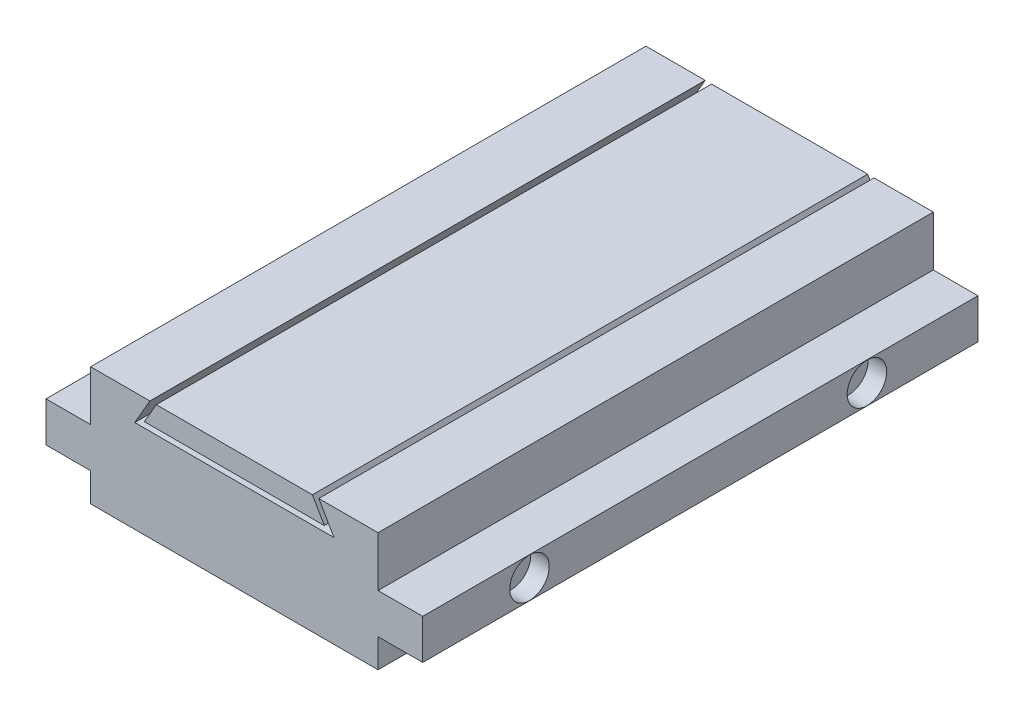
ISO-10303-21;
HEADER;
FILE_DESCRIPTION(('STEP AP214'),'2;1');
FILE_NAME('part.step','',(''),(''),'','','');
FILE_SCHEMA(('AUTOMOTIVE_DESIGN { 1 0 10303 214 1 1 1 1 }'));
ENDSEC;
DATA;
#1=APPLICATION_CONTEXT('core data for automotive mechanical design processes');
#2=APPLICATION_PROTOCOL_DEFINITION('international standard','automotive_design',2000,#1);
#3=PRODUCT_CONTEXT('',#1,'mechanical');
#4=PRODUCT('Part','Part','',(#3));
#5=PRODUCT_RELATED_PRODUCT_CATEGORY('part','',(#4));
#6=PRODUCT_DEFINITION_FORMATION('','',#4);
#7=PRODUCT_DEFINITION_CONTEXT('part definition',#1,'design');
#8=PRODUCT_DEFINITION('design','',#6,#7);
#9=PRODUCT_DEFINITION_SHAPE('','',#8);
#10=(LENGTH_UNIT() NAMED_UNIT(*) SI_UNIT(.MILLI.,.METRE.));
#11=(NAMED_UNIT(*) PLANE_ANGLE_UNIT() SI_UNIT($,.RADIAN.));
#12=(NAMED_UNIT(*) SI_UNIT($,.STERADIAN.) SOLID_ANGLE_UNIT());
#13=UNCERTAINTY_MEASURE_WITH_UNIT(LENGTH_MEASURE(1.E-05),#10,'distance_accuracy_value','');
#14=(GEOMETRIC_REPRESENTATION_CONTEXT(3) GLOBAL_UNCERTAINTY_ASSIGNED_CONTEXT((#13)) GLOBAL_UNIT_ASSIGNED_CONTEXT((#10,
#11,#12)) REPRESENTATION_CONTEXT('',''));
#15=CARTESIAN_POINT('',(0.,0.,0.));
#16=DIRECTION('',(0.,0.,1.));
#17=DIRECTION('',(1.,0.,0.));
#18=AXIS2_PLACEMENT_3D('',#15,#16,#17);
#19=CARTESIAN_POINT('',(0.,0.,0.));
#20=DIRECTION('',(0.,0.,-1.));
#21=DIRECTION('',(-1.,0.,0.));
#22=AXIS2_PLACEMENT_3D('',#19,#20,#21);
#23=PLANE('',#22);
#24=DIRECTION('',(1.,0.,0.));
#25=VECTOR('',#24,1.);
#26=CARTESIAN_POINT('',(-3.88140502764066,-3.208799954,0.));
#27=LINE('',#26,#25);
#28=CARTESIAN_POINT('',(-3.88140502764066,-3.208799954,0.));
#29=VERTEX_POINT('',#28);
#30=CARTESIAN_POINT('',(3.88140502764066,-3.208799954,0.));
#31=VERTEX_POINT('',#30);
#32=EDGE_CURVE('E179',#29,#31,#27,.T.);
#33=ORIENTED_EDGE('',*,*,#32,.F.);
#34=DIRECTION('',(0.,1.,0.));
#35=VECTOR('',#34,1.);
#36=CARTESIAN_POINT('',(-3.88140502764066,0.,0.));
#37=LINE('',#36,#35);
#38=CARTESIAN_POINT('',(-3.88140502764066,-2.4331984368042,0.));
#39=VERTEX_POINT('',#38);
#40=EDGE_CURVE('E317',#29,#39,#37,.T.);
#41=ORIENTED_EDGE('',*,*,#40,.T.);
#42=DIRECTION('',(-1.,0.,0.));
#43=VECTOR('',#42,1.);
#44=CARTESIAN_POINT('',(0.,-2.4331984368042,0.));
#45=LINE('',#44,#43);
#46=CARTESIAN_POINT('',(-5.08790502764066,-2.43319843680419,0.));
#47=VERTEX_POINT('',#46);
#48=EDGE_CURVE('E202',#39,#47,#45,.T.);
#49=ORIENTED_EDGE('',*,*,#48,.T.);
#50=DIRECTION('',(0.,1.,0.));
#51=VECTOR('',#50,1.);
#52=CARTESIAN_POINT('',(-5.08790502764066,0.,0.));
#53=LINE('',#52,#51);
#54=CARTESIAN_POINT('',(-5.08790502764066,-1.35369843680419,0.));
#55=VERTEX_POINT('',#54);
#56=EDGE_CURVE('E196',#47,#55,#53,.T.);
#57=ORIENTED_EDGE('',*,*,#56,.T.);
#58=DIRECTION('',(1.,0.,0.));
#59=VECTOR('',#58,1.);
#60=CARTESIAN_POINT('',(0.,-1.3536984368042,0.));
#61=LINE('',#60,#59);
#62=CARTESIAN_POINT('',(-3.88140502764066,-1.3536984368042,0.));
#63=VERTEX_POINT('',#62);
#64=EDGE_CURVE('E186',#55,#63,#61,.T.);
#65=ORIENTED_EDGE('',*,*,#64,.T.);
#66=DIRECTION('',(0.,-1.,0.));
#67=VECTOR('',#66,1.);
#68=CARTESIAN_POINT('',(-3.88140502764066,0.,0.));
#69=LINE('',#68,#67);
#70=CARTESIAN_POINT('',(-3.88140502764066,0.,0.));
#71=VERTEX_POINT('',#70);
#72=EDGE_CURVE('E98',#71,#63,#69,.T.);
#73=ORIENTED_EDGE('',*,*,#72,.F.);
#74=DIRECTION('',(-1.,0.,0.));
#75=VECTOR('',#74,1.);
#76=CARTESIAN_POINT('',(-2.28140502764066,0.,0.));
#77=LINE('',#76,#75);
#78=CARTESIAN_POINT('',(-2.28140502764066,0.,0.));
#79=VERTEX_POINT('',#78);
#80=EDGE_CURVE('E234',#79,#71,#77,.T.);
#81=ORIENTED_EDGE('',*,*,#80,.F.);
#82=DIRECTION('',(0.5,0.866025403784439,0.));
#83=VECTOR('',#82,1.);
#84=CARTESIAN_POINT('',(-2.28140502764066,0.,0.));
#85=LINE('',#84,#83);
#86=CARTESIAN_POINT('',(-2.69063087188416,-0.708799953999999,0.));
#87=VERTEX_POINT('',#86);
#88=EDGE_CURVE('E237',#87,#79,#85,.T.);
#89=ORIENTED_EDGE('',*,*,#88,.F.);
#90=DIRECTION('',(-1.,0.,0.));
#91=VECTOR('',#90,1.);
#92=CARTESIAN_POINT('',(-2.69063087188416,-0.708799953999999,0.));
#93=LINE('',#92,#91);
#94=CARTESIAN_POINT('',(2.69063087188416,-0.708799953999999,0.));
#95=VERTEX_POINT('',#94);
#96=EDGE_CURVE('E241',#95,#87,#93,.T.);
#97=ORIENTED_EDGE('',*,*,#96,.F.);
#98=DIRECTION('',(0.5,-0.866025403784439,0.));
#99=VECTOR('',#98,1.);
#100=CARTESIAN_POINT('',(2.69063087188416,-0.708799953999999,0.));
#101=LINE('',#100,#99);
#102=CARTESIAN_POINT('',(2.28140502764066,0.,0.));
#103=VERTEX_POINT('',#102);
#104=EDGE_CURVE('E244',#103,#95,#101,.T.);
#105=ORIENTED_EDGE('',*,*,#104,.F.);
#106=DIRECTION('',(-1.,0.,0.));
#107=VECTOR('',#106,1.);
#108=CARTESIAN_POINT('',(3.88140502764066,0.,0.));
#109=LINE('',#108,#107);
#110=CARTESIAN_POINT('',(3.88140502764066,0.,0.));
#111=VERTEX_POINT('',#110);
#112=EDGE_CURVE('E247',#111,#103,#109,.T.);
#113=ORIENTED_EDGE('',*,*,#112,.F.);
#114=DIRECTION('',(0.,1.,0.));
#115=VECTOR('',#114,1.);
#116=CARTESIAN_POINT('',(3.88140502764066,-3.208799954,0.));
#117=LINE('',#116,#115);
#118=CARTESIAN_POINT('',(3.88140502764066,-1.3536984368042,0.));
#119=VERTEX_POINT('',#118);
#120=EDGE_CURVE('E92',#119,#111,#117,.T.);
#121=ORIENTED_EDGE('',*,*,#120,.F.);
#122=DIRECTION('',(1.,0.,0.));
#123=VECTOR('',#122,1.);
#124=CARTESIAN_POINT('',(0.,-1.3536984368042,0.));
#125=LINE('',#124,#123);
#126=CARTESIAN_POINT('',(5.08790502764066,-1.3536984368042,0.));
#127=VERTEX_POINT('',#126);
#128=EDGE_CURVE('E323',#119,#127,#125,.T.);
#129=ORIENTED_EDGE('',*,*,#128,.T.);
#130=DIRECTION('',(0.,-1.,0.));
#131=VECTOR('',#130,1.);
#132=CARTESIAN_POINT('',(5.08790502764066,0.,0.));
#133=LINE('',#132,#131);
#134=CARTESIAN_POINT('',(5.08790502764066,-2.4331984368042,0.));
#135=VERTEX_POINT('',#134);
#136=EDGE_CURVE('E326',#127,#135,#133,.T.);
#137=ORIENTED_EDGE('',*,*,#136,.T.);
#138=DIRECTION('',(-1.,0.,0.));
#139=VECTOR('',#138,1.);
#140=CARTESIAN_POINT('',(0.,-2.4331984368042,0.));
#141=LINE('',#140,#139);
#142=CARTESIAN_POINT('',(3.88140502764066,-2.4331984368042,0.));
#143=VERTEX_POINT('',#142);
#144=EDGE_CURVE('E320',#135,#143,#141,.T.);
#145=ORIENTED_EDGE('',*,*,#144,.T.);
#146=DIRECTION('',(0.,-1.,0.));
#147=VECTOR('',#146,1.);
#148=CARTESIAN_POINT('',(3.88140502764066,0.,0.));
#149=LINE('',#148,#147);
#150=EDGE_CURVE('E296',#143,#31,#149,.T.);
#151=ORIENTED_EDGE('',*,*,#150,.T.);
#152=EDGE_LOOP('',(#33,#41,#49,#57,#65,#73,#81,#89,#97,#105,#113,#121,#129,#137,#145,#151));
#153=FACE_BOUND('',#152,.T.);
#154=ADVANCED_FACE('F49',(#153),#23,.T.);
#155=CARTESIAN_POINT('',(0.,0.,15.));
#156=DIRECTION('',(0.,0.,1.));
#157=DIRECTION('',(1.,0.,0.));
#158=AXIS2_PLACEMENT_3D('',#155,#156,#157);
#159=PLANE('',#158);
#160=DIRECTION('',(1.,0.,0.));
#161=VECTOR('',#160,1.);
#162=CARTESIAN_POINT('',(0.,-2.4331984368042,15.));
#163=LINE('',#162,#161);
#164=CARTESIAN_POINT('',(-5.08790502764066,-2.43319843680419,15.));
#165=VERTEX_POINT('',#164);
#166=CARTESIAN_POINT('',(-3.88140502764066,-2.4331984368042,15.));
#167=VERTEX_POINT('',#166);
#168=EDGE_CURVE('E12',#165,#167,#163,.T.);
#169=ORIENTED_EDGE('',*,*,#168,.T.);
#170=DIRECTION('',(0.,-1.,0.));
#171=VECTOR('',#170,1.);
#172=CARTESIAN_POINT('',(-3.88140502764066,0.,15.));
#173=LINE('',#172,#171);
#174=CARTESIAN_POINT('',(-3.88140502764066,-3.208799954,15.));
#175=VERTEX_POINT('',#174);
#176=EDGE_CURVE('E315',#167,#175,#173,.T.);
#177=ORIENTED_EDGE('',*,*,#176,.T.);
#178=DIRECTION('',(1.,0.,0.));
#179=VECTOR('',#178,1.);
#180=CARTESIAN_POINT('',(-3.88140502764066,-3.208799954,15.));
#181=LINE('',#180,#179);
#182=CARTESIAN_POINT('',(3.88140502764066,-3.208799954,15.));
#183=VERTEX_POINT('',#182);
#184=EDGE_CURVE('E225',#175,#183,#181,.T.);
#185=ORIENTED_EDGE('',*,*,#184,.T.);
#186=DIRECTION('',(0.,1.,0.));
#187=VECTOR('',#186,1.);
#188=CARTESIAN_POINT('',(3.88140502764066,0.,15.));
#189=LINE('',#188,#187);
#190=CARTESIAN_POINT('',(3.88140502764066,-2.4331984368042,15.));
#191=VERTEX_POINT('',#190);
#192=EDGE_CURVE('E293',#183,#191,#189,.T.);
#193=ORIENTED_EDGE('',*,*,#192,.T.);
#194=DIRECTION('',(1.,0.,0.));
#195=VECTOR('',#194,1.);
#196=CARTESIAN_POINT('',(0.,-2.4331984368042,15.));
#197=LINE('',#196,#195);
#198=CARTESIAN_POINT('',(5.08790502764066,-2.4331984368042,15.));
#199=VERTEX_POINT('',#198);
#200=EDGE_CURVE('E276',#191,#199,#197,.T.);
#201=ORIENTED_EDGE('',*,*,#200,.T.);
#202=DIRECTION('',(0.,1.,0.));
#203=VECTOR('',#202,1.);
#204=CARTESIAN_POINT('',(5.08790502764066,0.,15.));
#205=LINE('',#204,#203);
#206=CARTESIAN_POINT('',(5.08790502764066,-1.3536984368042,15.));
#207=VERTEX_POINT('',#206);
#208=EDGE_CURVE('E279',#199,#207,#205,.T.);
#209=ORIENTED_EDGE('',*,*,#208,.T.);
#210=DIRECTION('',(-1.,0.,0.));
#211=VECTOR('',#210,1.);
#212=CARTESIAN_POINT('',(0.,-1.3536984368042,15.));
#213=LINE('',#212,#211);
#214=CARTESIAN_POINT('',(3.88140502764066,-1.3536984368042,15.));
#215=VERTEX_POINT('',#214);
#216=EDGE_CURVE('E282',#207,#215,#213,.T.);
#217=ORIENTED_EDGE('',*,*,#216,.T.);
#218=DIRECTION('',(0.,1.,0.));
#219=VECTOR('',#218,1.);
#220=CARTESIAN_POINT('',(3.88140502764066,-3.208799954,15.));
#221=LINE('',#220,#219);
#222=CARTESIAN_POINT('',(3.88140502764066,0.,15.));
#223=VERTEX_POINT('',#222);
#224=EDGE_CURVE('E105',#215,#223,#221,.T.);
#225=ORIENTED_EDGE('',*,*,#224,.T.);
#226=DIRECTION('',(-1.,0.,0.));
#227=VECTOR('',#226,1.);
#228=CARTESIAN_POINT('',(3.88140502764066,0.,15.));
#229=LINE('',#228,#227);
#230=CARTESIAN_POINT('',(2.28140502764066,0.,15.));
#231=VERTEX_POINT('',#230);
#232=EDGE_CURVE('E222',#223,#231,#229,.T.);
#233=ORIENTED_EDGE('',*,*,#232,.T.);
#234=DIRECTION('',(0.5,-0.866025403784439,0.));
#235=VECTOR('',#234,1.);
#236=CARTESIAN_POINT('',(2.69063087188416,-0.708799953999999,15.));
#237=LINE('',#236,#235);
#238=CARTESIAN_POINT('',(2.69063087188416,-0.708799953999999,15.));
#239=VERTEX_POINT('',#238);
#240=EDGE_CURVE('E219',#231,#239,#237,.T.);
#241=ORIENTED_EDGE('',*,*,#240,.T.);
#242=DIRECTION('',(-1.,0.,0.));
#243=VECTOR('',#242,1.);
#244=CARTESIAN_POINT('',(-2.69063087188416,-0.708799953999999,15.));
#245=LINE('',#244,#243);
#246=CARTESIAN_POINT('',(-2.69063087188416,-0.708799953999999,15.));
#247=VERTEX_POINT('',#246);
#248=EDGE_CURVE('E217',#239,#247,#245,.T.);
#249=ORIENTED_EDGE('',*,*,#248,.T.);
#250=DIRECTION('',(0.5,0.866025403784439,0.));
#251=VECTOR('',#250,1.);
#252=CARTESIAN_POINT('',(-2.28140502764066,0.,15.));
#253=LINE('',#252,#251);
#254=CARTESIAN_POINT('',(-2.28140502764066,0.,15.));
#255=VERTEX_POINT('',#254);
#256=EDGE_CURVE('E180',#247,#255,#253,.T.);
#257=ORIENTED_EDGE('',*,*,#256,.T.);
#258=DIRECTION('',(-1.,0.,0.));
#259=VECTOR('',#258,1.);
#260=CARTESIAN_POINT('',(-2.28140502764066,0.,15.));
#261=LINE('',#260,#259);
#262=CARTESIAN_POINT('',(-3.88140502764066,0.,15.));
#263=VERTEX_POINT('',#262);
#264=EDGE_CURVE('E230',#255,#263,#261,.T.);
#265=ORIENTED_EDGE('',*,*,#264,.T.);
#266=DIRECTION('',(0.,-1.,0.));
#267=VECTOR('',#266,1.);
#268=CARTESIAN_POINT('',(-3.88140502764066,0.,15.));
#269=LINE('',#268,#267);
#270=CARTESIAN_POINT('',(-3.88140502764066,-1.3536984368042,15.));
#271=VERTEX_POINT('',#270);
#272=EDGE_CURVE('E228',#263,#271,#269,.T.);
#273=ORIENTED_EDGE('',*,*,#272,.T.);
#274=DIRECTION('',(-1.,0.,0.));
#275=VECTOR('',#274,1.);
#276=CARTESIAN_POINT('',(0.,-1.3536984368042,15.));
#277=LINE('',#276,#275);
#278=CARTESIAN_POINT('',(-5.08790502764066,-1.35369843680419,15.));
#279=VERTEX_POINT('',#278);
#280=EDGE_CURVE('E189',#271,#279,#277,.T.);
#281=ORIENTED_EDGE('',*,*,#280,.T.);
#282=DIRECTION('',(0.,-1.,0.));
#283=VECTOR('',#282,1.);
#284=CARTESIAN_POINT('',(-5.08790502764066,0.,15.));
#285=LINE('',#284,#283);
#286=EDGE_CURVE('E57',#279,#165,#285,.T.);
#287=ORIENTED_EDGE('',*,*,#286,.T.);
#288=EDGE_LOOP('',(#169,#177,#185,#193,#201,#209,#217,#225,#233,#241,#249,#257,#265,#273,#281,#287));
#289=FACE_BOUND('',#288,.T.);
#290=ADVANCED_FACE('F285',(#289),#159,.T.);
#291=CARTESIAN_POINT('',(-3.88140502764066,-3.208799954,-8.39985815946717));
#292=DIRECTION('',(0.,-1.,0.));
#293=DIRECTION('',(0.,0.,-1.));
#294=AXIS2_PLACEMENT_3D('',#291,#292,#293);
#295=PLANE('',#294);
#296=CARTESIAN_POINT('',(0.,-3.208799954,13.73));
#297=DIRECTION('',(0.,-1.,0.));
#298=DIRECTION('',(0.,0.,-1.));
#299=AXIS2_PLACEMENT_3D('',#296,#297,#298);
#300=CIRCLE('',#299,0.533400000000001);
#301=CARTESIAN_POINT('',(0.,-3.208799954,13.1966));
#302=VERTEX_POINT('',#301);
#303=EDGE_CURVE('E206',#302,#302,#300,.T.);
#304=ORIENTED_EDGE('',*,*,#303,.F.);
#305=EDGE_LOOP('',(#304));
#306=FACE_BOUND('',#305,.T.);
#307=CARTESIAN_POINT('',(0.,-3.208799954,9.92));
#308=DIRECTION('',(0.,-1.,0.));
#309=DIRECTION('',(0.,0.,-1.));
#310=AXIS2_PLACEMENT_3D('',#307,#308,#309);
#311=CIRCLE('',#310,0.533400000000001);
#312=CARTESIAN_POINT('',(0.,-3.208799954,9.3866));
#313=VERTEX_POINT('',#312);
#314=EDGE_CURVE('E210',#313,#313,#311,.T.);
#315=ORIENTED_EDGE('',*,*,#314,.F.);
#316=EDGE_LOOP('',(#315));
#317=FACE_BOUND('',#316,.T.);
#318=CARTESIAN_POINT('',(0.,-3.208799954,6.11));
#319=DIRECTION('',(0.,-1.,0.));
#320=DIRECTION('',(0.,0.,-1.));
#321=AXIS2_PLACEMENT_3D('',#318,#319,#320);
#322=CIRCLE('',#321,0.533400000000001);
#323=CARTESIAN_POINT('',(0.,-3.208799954,5.5766));
#324=VERTEX_POINT('',#323);
#325=EDGE_CURVE('E200',#324,#324,#322,.T.);
#326=ORIENTED_EDGE('',*,*,#325,.F.);
#327=EDGE_LOOP('',(#326));
#328=FACE_BOUND('',#327,.T.);
#329=CARTESIAN_POINT('',(1.19722895108931E-13,-3.208799954,2.3));
#330=DIRECTION('',(0.,-1.,0.));
#331=DIRECTION('',(0.,0.,-1.));
#332=AXIS2_PLACEMENT_3D('',#329,#330,#331);
#333=CIRCLE('',#332,0.533400000000001);
#334=CARTESIAN_POINT('',(1.19722895108931E-13,-3.208799954,1.7666));
#335=VERTEX_POINT('',#334);
#336=EDGE_CURVE('E197',#335,#335,#333,.T.);
#337=ORIENTED_EDGE('',*,*,#336,.F.);
#338=EDGE_LOOP('',(#337));
#339=FACE_BOUND('',#338,.T.);
#340=ORIENTED_EDGE('',*,*,#184,.F.);
#341=DIRECTION('',(0.,0.,-1.));
#342=VECTOR('',#341,1.);
#343=CARTESIAN_POINT('',(-3.88140502764066,-3.208799954,-8.39985815946717));
#344=LINE('',#343,#342);
#345=EDGE_CURVE('E273',#175,#29,#344,.T.);
#346=ORIENTED_EDGE('',*,*,#345,.T.);
#347=ORIENTED_EDGE('',*,*,#32,.T.);
#348=DIRECTION('',(0.,0.,1.));
#349=VECTOR('',#348,1.);
#350=CARTESIAN_POINT('',(3.88140502764066,-3.208799954,-8.39985815946717));
#351=LINE('',#350,#349);
#352=EDGE_CURVE('E260',#31,#183,#351,.T.);
#353=ORIENTED_EDGE('',*,*,#352,.T.);
#354=EDGE_LOOP('',(#340,#346,#347,#353));
#355=FACE_BOUND('',#354,.T.);
#356=ADVANCED_FACE('F386',(#306,#317,#328,#339,#355),#295,.T.);
#357=CARTESIAN_POINT('',(-3.88140502764066,0.,-8.39985815946717));
#358=DIRECTION('',(-1.,0.,0.));
#359=DIRECTION('',(0.,0.,1.));
#360=AXIS2_PLACEMENT_3D('',#357,#358,#359);
#361=PLANE('',#360);
#362=DIRECTION('',(0.,0.,1.));
#363=VECTOR('',#362,1.);
#364=CARTESIAN_POINT('',(-3.88140502764066,-1.3536984368042,-10.));
#365=LINE('',#364,#363);
#366=EDGE_CURVE('E178',#63,#271,#365,.T.);
#367=ORIENTED_EDGE('',*,*,#366,.T.);
#368=ORIENTED_EDGE('',*,*,#272,.F.);
#369=DIRECTION('',(0.,0.,1.));
#370=VECTOR('',#369,1.);
#371=CARTESIAN_POINT('',(-3.88140502764066,0.,-8.39985815946717));
#372=LINE('',#371,#370);
#373=EDGE_CURVE('E65',#71,#263,#372,.T.);
#374=ORIENTED_EDGE('',*,*,#373,.F.);
#375=ORIENTED_EDGE('',*,*,#72,.T.);
#376=EDGE_LOOP('',(#367,#368,#374,#375));
#377=FACE_BOUND('',#376,.T.);
#378=ADVANCED_FACE('F177',(#377),#361,.T.);
#379=CARTESIAN_POINT('',(3.88140502764066,-3.208799954,-8.39985815946717));
#380=DIRECTION('',(1.,0.,0.));
#381=DIRECTION('',(0.,0.,-1.));
#382=AXIS2_PLACEMENT_3D('',#379,#380,#381);
#383=PLANE('',#382);
#384=ORIENTED_EDGE('',*,*,#120,.T.);
#385=DIRECTION('',(0.,0.,1.));
#386=VECTOR('',#385,1.);
#387=CARTESIAN_POINT('',(3.88140502764066,0.,-8.39985815946717));
#388=LINE('',#387,#386);
#389=EDGE_CURVE('E249',#111,#223,#388,.T.);
#390=ORIENTED_EDGE('',*,*,#389,.T.);
#391=ORIENTED_EDGE('',*,*,#224,.F.);
#392=DIRECTION('',(0.,0.,1.));
#393=VECTOR('',#392,1.);
#394=CARTESIAN_POINT('',(3.88140502764066,-1.3536984368042,-10.));
#395=LINE('',#394,#393);
#396=EDGE_CURVE('E308',#119,#215,#395,.T.);
#397=ORIENTED_EDGE('',*,*,#396,.F.);
#398=EDGE_LOOP('',(#384,#390,#391,#397));
#399=FACE_BOUND('',#398,.T.);
#400=ADVANCED_FACE('F394',(#399),#383,.T.);
#401=CARTESIAN_POINT('',(3.88140502764066,0.,-8.39985815946717));
#402=DIRECTION('',(0.,1.,0.));
#403=DIRECTION('',(0.,0.,1.));
#404=AXIS2_PLACEMENT_3D('',#401,#402,#403);
#405=PLANE('',#404);
#406=ORIENTED_EDGE('',*,*,#389,.F.);
#407=ORIENTED_EDGE('',*,*,#112,.T.);
#408=DIRECTION('',(0.,0.,1.));
#409=VECTOR('',#408,1.);
#410=CARTESIAN_POINT('',(2.28140502764066,0.,-8.39985815946717));
#411=LINE('',#410,#409);
#412=EDGE_CURVE('E112',#103,#231,#411,.T.);
#413=ORIENTED_EDGE('',*,*,#412,.T.);
#414=ORIENTED_EDGE('',*,*,#232,.F.);
#415=EDGE_LOOP('',(#406,#407,#413,#414));
#416=FACE_BOUND('',#415,.T.);
#417=ADVANCED_FACE('F432',(#416),#405,.T.);
#418=CARTESIAN_POINT('',(2.69063087188416,-0.708799953999999,-8.39985815946717));
#419=DIRECTION('',(-0.866025403784439,-0.5,0.));
#420=DIRECTION('',(0.5,-0.866025403784439,0.));
#421=AXIS2_PLACEMENT_3D('',#418,#419,#420);
#422=PLANE('',#421);
#423=ORIENTED_EDGE('',*,*,#412,.F.);
#424=ORIENTED_EDGE('',*,*,#104,.T.);
#425=DIRECTION('',(0.,0.,1.));
#426=VECTOR('',#425,1.);
#427=CARTESIAN_POINT('',(2.69063087188416,-0.708799953999999,-8.39985815946717));
#428=LINE('',#427,#426);
#429=EDGE_CURVE('E243',#95,#239,#428,.T.);
#430=ORIENTED_EDGE('',*,*,#429,.T.);
#431=ORIENTED_EDGE('',*,*,#240,.F.);
#432=EDGE_LOOP('',(#423,#424,#430,#431));
#433=FACE_BOUND('',#432,.T.);
#434=ADVANCED_FACE('F600',(#433),#422,.T.);
#435=CARTESIAN_POINT('',(-2.69063087188416,-0.708799953999999,-8.39985815946717));
#436=DIRECTION('',(0.,1.,0.));
#437=DIRECTION('',(-1.,0.,0.));
#438=AXIS2_PLACEMENT_3D('',#435,#436,#437);
#439=PLANE('',#438);
#440=ORIENTED_EDGE('',*,*,#96,.T.);
#441=DIRECTION('',(0.,0.,1.));
#442=VECTOR('',#441,1.);
#443=CARTESIAN_POINT('',(-2.69063087188416,-0.708799953999999,-8.39985815946717));
#444=LINE('',#443,#442);
#445=EDGE_CURVE('E240',#87,#247,#444,.T.);
#446=ORIENTED_EDGE('',*,*,#445,.T.);
#447=ORIENTED_EDGE('',*,*,#248,.F.);
#448=ORIENTED_EDGE('',*,*,#429,.F.);
#449=EDGE_LOOP('',(#440,#446,#447,#448));
#450=FACE_BOUND('',#449,.T.);
#451=CARTESIAN_POINT('',(0.,-0.708799953999999,13.73));
#452=DIRECTION('',(0.,1.,0.));
#453=DIRECTION('',(-1.,0.,0.));
#454=AXIS2_PLACEMENT_3D('',#451,#452,#453);
#455=CIRCLE('',#454,0.533400000000001);
#456=CARTESIAN_POINT('',(-0.533400000000001,-0.708799953999999,13.73));
#457=VERTEX_POINT('',#456);
#458=EDGE_CURVE('E232',#457,#457,#455,.T.);
#459=ORIENTED_EDGE('',*,*,#458,.F.);
#460=EDGE_LOOP('',(#459));
#461=FACE_BOUND('',#460,.T.);
#462=CARTESIAN_POINT('',(0.,-0.708799953999999,9.92));
#463=DIRECTION('',(0.,1.,0.));
#464=DIRECTION('',(-1.,0.,0.));
#465=AXIS2_PLACEMENT_3D('',#462,#463,#464);
#466=CIRCLE('',#465,0.533400000000001);
#467=CARTESIAN_POINT('',(-0.533399999999961,-0.708799953999999,9.92));
#468=VERTEX_POINT('',#467);
#469=EDGE_CURVE('E266',#468,#468,#466,.T.);
#470=ORIENTED_EDGE('',*,*,#469,.F.);
#471=EDGE_LOOP('',(#470));
#472=FACE_BOUND('',#471,.T.);
#473=CARTESIAN_POINT('',(0.,-0.708799953999999,6.11));
#474=DIRECTION('',(0.,1.,0.));
#475=DIRECTION('',(-1.,0.,0.));
#476=AXIS2_PLACEMENT_3D('',#473,#474,#475);
#477=CIRCLE('',#476,0.533400000000001);
#478=CARTESIAN_POINT('',(-0.533399999999921,-0.708799953999999,6.11));
#479=VERTEX_POINT('',#478);
#480=EDGE_CURVE('E263',#479,#479,#477,.T.);
#481=ORIENTED_EDGE('',*,*,#480,.F.);
#482=EDGE_LOOP('',(#481));
#483=FACE_BOUND('',#482,.T.);
#484=CARTESIAN_POINT('',(1.19722895108931E-13,-0.708799953999999,2.3));
#485=DIRECTION('',(0.,1.,0.));
#486=DIRECTION('',(-1.,0.,0.));
#487=AXIS2_PLACEMENT_3D('',#484,#485,#486);
#488=CIRCLE('',#487,0.533400000000001);
#489=CARTESIAN_POINT('',(-0.533399999999881,-0.708799953999999,2.3));
#490=VERTEX_POINT('',#489);
#491=EDGE_CURVE('E209',#490,#490,#488,.T.);
#492=ORIENTED_EDGE('',*,*,#491,.F.);
#493=EDGE_LOOP('',(#492));
#494=FACE_BOUND('',#493,.T.);
#495=ADVANCED_FACE('F596',(#450,#461,#472,#483,#494),#439,.T.);
#496=CARTESIAN_POINT('',(-2.28140502764066,0.,-8.39985815946717));
#497=DIRECTION('',(0.866025403784439,-0.5,0.));
#498=DIRECTION('',(0.5,0.866025403784439,0.));
#499=AXIS2_PLACEMENT_3D('',#496,#497,#498);
#500=PLANE('',#499);
#501=ORIENTED_EDGE('',*,*,#445,.F.);
#502=ORIENTED_EDGE('',*,*,#88,.T.);
#503=DIRECTION('',(0.,0.,1.));
#504=VECTOR('',#503,1.);
#505=CARTESIAN_POINT('',(-2.28140502764066,0.,-8.39985815946717));
#506=LINE('',#505,#504);
#507=EDGE_CURVE('E236',#79,#255,#506,.T.);
#508=ORIENTED_EDGE('',*,*,#507,.T.);
#509=ORIENTED_EDGE('',*,*,#256,.F.);
#510=EDGE_LOOP('',(#501,#502,#508,#509));
#511=FACE_BOUND('',#510,.T.);
#512=ADVANCED_FACE('F593',(#511),#500,.T.);
#513=CARTESIAN_POINT('',(-2.28140502764066,0.,-8.39985815946717));
#514=DIRECTION('',(0.,1.,0.));
#515=DIRECTION('',(0.,0.,1.));
#516=AXIS2_PLACEMENT_3D('',#513,#514,#515);
#517=PLANE('',#516);
#518=ORIENTED_EDGE('',*,*,#507,.F.);
#519=ORIENTED_EDGE('',*,*,#80,.T.);
#520=ORIENTED_EDGE('',*,*,#373,.T.);
#521=ORIENTED_EDGE('',*,*,#264,.F.);
#522=EDGE_LOOP('',(#518,#519,#520,#521));
#523=FACE_BOUND('',#522,.T.);
#524=ADVANCED_FACE('F588',(#523),#517,.T.);
#525=CARTESIAN_POINT('',(1.19722895108931E-13,0.,2.3));
#526=DIRECTION('',(0.,-1.,0.));
#527=DIRECTION('',(0.,0.,-1.));
#528=AXIS2_PLACEMENT_3D('',#525,#526,#527);
#529=CYLINDRICAL_SURFACE('',#528,0.533400000000001);
#530=ORIENTED_EDGE('',*,*,#491,.T.);
#531=EDGE_LOOP('',(#530));
#532=FACE_BOUND('',#531,.T.);
#533=ORIENTED_EDGE('',*,*,#336,.T.);
#534=EDGE_LOOP('',(#533));
#535=FACE_BOUND('',#534,.T.);
#536=ADVANCED_FACE('F585',(#532,#535),#529,.F.);
#537=CARTESIAN_POINT('',(0.,0.,6.11));
#538=DIRECTION('',(0.,-1.,0.));
#539=DIRECTION('',(0.,0.,-1.));
#540=AXIS2_PLACEMENT_3D('',#537,#538,#539);
#541=CYLINDRICAL_SURFACE('',#540,0.533400000000001);
#542=ORIENTED_EDGE('',*,*,#480,.T.);
#543=EDGE_LOOP('',(#542));
#544=FACE_BOUND('',#543,.T.);
#545=ORIENTED_EDGE('',*,*,#325,.T.);
#546=EDGE_LOOP('',(#545));
#547=FACE_BOUND('',#546,.T.);
#548=ADVANCED_FACE('F581',(#544,#547),#541,.F.);
#549=CARTESIAN_POINT('',(0.,0.,9.92));
#550=DIRECTION('',(0.,-1.,0.));
#551=DIRECTION('',(0.,0.,-1.));
#552=AXIS2_PLACEMENT_3D('',#549,#550,#551);
#553=CYLINDRICAL_SURFACE('',#552,0.533400000000001);
#554=ORIENTED_EDGE('',*,*,#469,.T.);
#555=EDGE_LOOP('',(#554));
#556=FACE_BOUND('',#555,.T.);
#557=ORIENTED_EDGE('',*,*,#314,.T.);
#558=EDGE_LOOP('',(#557));
#559=FACE_BOUND('',#558,.T.);
#560=ADVANCED_FACE('F577',(#556,#559),#553,.F.);
#561=CARTESIAN_POINT('',(0.,0.,13.73));
#562=DIRECTION('',(0.,-1.,0.));
#563=DIRECTION('',(0.,0.,-1.));
#564=AXIS2_PLACEMENT_3D('',#561,#562,#563);
#565=CYLINDRICAL_SURFACE('',#564,0.533400000000001);
#566=ORIENTED_EDGE('',*,*,#458,.T.);
#567=EDGE_LOOP('',(#566));
#568=FACE_BOUND('',#567,.T.);
#569=ORIENTED_EDGE('',*,*,#303,.T.);
#570=EDGE_LOOP('',(#569));
#571=FACE_BOUND('',#570,.T.);
#572=ADVANCED_FACE('F441',(#568,#571),#565,.F.);
#573=CARTESIAN_POINT('',(-5.08790502764066,-1.35369843680419,-10.));
#574=DIRECTION('',(0.,1.,0.));
#575=DIRECTION('',(-1.,0.,0.));
#576=AXIS2_PLACEMENT_3D('',#573,#574,#575);
#577=PLANE('',#576);
#578=DIRECTION('',(0.,0.,1.));
#579=VECTOR('',#578,1.);
#580=CARTESIAN_POINT('',(-5.08790502764066,-1.35369843680419,-10.));
#581=LINE('',#580,#579);
#582=EDGE_CURVE('E290',#55,#279,#581,.T.);
#583=ORIENTED_EDGE('',*,*,#582,.T.);
#584=ORIENTED_EDGE('',*,*,#280,.F.);
#585=ORIENTED_EDGE('',*,*,#366,.F.);
#586=ORIENTED_EDGE('',*,*,#64,.F.);
#587=EDGE_LOOP('',(#583,#584,#585,#586));
#588=FACE_BOUND('',#587,.T.);
#589=ADVANCED_FACE('F185',(#588),#577,.T.);
#590=CARTESIAN_POINT('',(-5.08790502764066,-2.43319843680419,-10.));
#591=DIRECTION('',(-1.,0.,0.));
#592=DIRECTION('',(0.,0.,1.));
#593=AXIS2_PLACEMENT_3D('',#590,#591,#592);
#594=PLANE('',#593);
#595=CARTESIAN_POINT('',(-5.08790502764066,-1.89344843680419,3.));
#596=DIRECTION('',(-1.,0.,0.));
#597=DIRECTION('',(0.,-1.,0.));
#598=AXIS2_PLACEMENT_3D('',#595,#596,#597);
#599=CIRCLE('',#598,0.5334);
#600=CARTESIAN_POINT('',(-5.08790502764066,-2.42684843680419,3.));
#601=VERTEX_POINT('',#600);
#602=EDGE_CURVE('E342',#601,#601,#599,.T.);
#603=ORIENTED_EDGE('',*,*,#602,.F.);
#604=EDGE_LOOP('',(#603));
#605=FACE_BOUND('',#604,.T.);
#606=CARTESIAN_POINT('',(-5.08790502764066,-1.89344843680419,12.));
#607=DIRECTION('',(-1.,0.,0.));
#608=DIRECTION('',(0.,-1.,0.));
#609=AXIS2_PLACEMENT_3D('',#606,#607,#608);
#610=CIRCLE('',#609,0.533400004449535);
#611=CARTESIAN_POINT('',(-5.08790502764066,-2.42684844125373,12.));
#612=VERTEX_POINT('',#611);
#613=EDGE_CURVE('E335',#612,#612,#610,.T.);
#614=ORIENTED_EDGE('',*,*,#613,.F.);
#615=EDGE_LOOP('',(#614));
#616=FACE_BOUND('',#615,.T.);
#617=DIRECTION('',(0.,0.,1.));
#618=VECTOR('',#617,1.);
#619=CARTESIAN_POINT('',(-5.08790502764066,-2.43319843680419,-10.));
#620=LINE('',#619,#618);
#621=EDGE_CURVE('E292',#47,#165,#620,.T.);
#622=ORIENTED_EDGE('',*,*,#621,.T.);
#623=ORIENTED_EDGE('',*,*,#286,.F.);
#624=ORIENTED_EDGE('',*,*,#582,.F.);
#625=ORIENTED_EDGE('',*,*,#56,.F.);
#626=EDGE_LOOP('',(#622,#623,#624,#625));
#627=FACE_BOUND('',#626,.T.);
#628=ADVANCED_FACE('F289',(#605,#616,#627),#594,.T.);
#629=CARTESIAN_POINT('',(-3.88140502764066,-2.4331984368042,-10.));
#630=DIRECTION('',(0.,-1.,0.));
#631=DIRECTION('',(1.,0.,0.));
#632=AXIS2_PLACEMENT_3D('',#629,#630,#631);
#633=PLANE('',#632);
#634=DIRECTION('',(0.,0.,1.));
#635=VECTOR('',#634,1.);
#636=CARTESIAN_POINT('',(-3.88140502764066,-2.4331984368042,-10.));
#637=LINE('',#636,#635);
#638=EDGE_CURVE('E190',#39,#167,#637,.T.);
#639=ORIENTED_EDGE('',*,*,#638,.T.);
#640=ORIENTED_EDGE('',*,*,#168,.F.);
#641=ORIENTED_EDGE('',*,*,#621,.F.);
#642=ORIENTED_EDGE('',*,*,#48,.F.);
#643=EDGE_LOOP('',(#639,#640,#641,#642));
#644=FACE_BOUND('',#643,.T.);
#645=ADVANCED_FACE('F331',(#644),#633,.T.);
#646=CARTESIAN_POINT('',(-3.88140502764066,-3.708799954,-10.));
#647=DIRECTION('',(-1.,0.,0.));
#648=DIRECTION('',(0.,0.,1.));
#649=AXIS2_PLACEMENT_3D('',#646,#647,#648);
#650=PLANE('',#649);
#651=ORIENTED_EDGE('',*,*,#345,.F.);
#652=ORIENTED_EDGE('',*,*,#176,.F.);
#653=ORIENTED_EDGE('',*,*,#638,.F.);
#654=ORIENTED_EDGE('',*,*,#40,.F.);
#655=EDGE_LOOP('',(#651,#652,#653,#654));
#656=FACE_BOUND('',#655,.T.);
#657=ADVANCED_FACE('F333',(#656),#650,.T.);
#658=CARTESIAN_POINT('',(5.08790502764066,-2.4331984368042,-10.));
#659=DIRECTION('',(1.,0.,0.));
#660=DIRECTION('',(0.,0.,-1.));
#661=AXIS2_PLACEMENT_3D('',#658,#659,#660);
#662=PLANE('',#661);
#663=CARTESIAN_POINT('',(5.08790502764066,-1.8934484368042,12.1154800925036));
#664=DIRECTION('',(1.,0.,0.));
#665=DIRECTION('',(0.,0.,-1.));
#666=AXIS2_PLACEMENT_3D('',#663,#664,#665);
#667=CIRCLE('',#666,0.53340000432162);
#668=CARTESIAN_POINT('',(5.08790502764066,-1.8934484368042,11.582080088182));
#669=VERTEX_POINT('',#668);
#670=EDGE_CURVE('E353',#669,#669,#667,.T.);
#671=ORIENTED_EDGE('',*,*,#670,.F.);
#672=EDGE_LOOP('',(#671));
#673=FACE_BOUND('',#672,.T.);
#674=CARTESIAN_POINT('',(5.08790502764066,-1.8934484368042,3.));
#675=DIRECTION('',(1.,0.,0.));
#676=DIRECTION('',(0.,0.,-1.));
#677=AXIS2_PLACEMENT_3D('',#674,#675,#676);
#678=CIRCLE('',#677,0.533400004321622);
#679=CARTESIAN_POINT('',(5.08790502764066,-1.8934484368042,2.46659999567838));
#680=VERTEX_POINT('',#679);
#681=EDGE_CURVE('E347',#680,#680,#678,.T.);
#682=ORIENTED_EDGE('',*,*,#681,.F.);
#683=EDGE_LOOP('',(#682));
#684=FACE_BOUND('',#683,.T.);
#685=DIRECTION('',(0.,0.,1.));
#686=VECTOR('',#685,1.);
#687=CARTESIAN_POINT('',(5.08790502764066,-1.3536984368042,-10.));
#688=LINE('',#687,#686);
#689=EDGE_CURVE('E191',#127,#207,#688,.T.);
#690=ORIENTED_EDGE('',*,*,#689,.T.);
#691=ORIENTED_EDGE('',*,*,#208,.F.);
#692=DIRECTION('',(0.,0.,1.));
#693=VECTOR('',#692,1.);
#694=CARTESIAN_POINT('',(5.08790502764066,-2.4331984368042,-10.));
#695=LINE('',#694,#693);
#696=EDGE_CURVE('E301',#135,#199,#695,.T.);
#697=ORIENTED_EDGE('',*,*,#696,.F.);
#698=ORIENTED_EDGE('',*,*,#136,.F.);
#699=EDGE_LOOP('',(#690,#691,#697,#698));
#700=FACE_BOUND('',#699,.T.);
#701=ADVANCED_FACE('F368',(#673,#684,#700),#662,.T.);
#702=CARTESIAN_POINT('',(5.08790502764066,-1.3536984368042,-10.));
#703=DIRECTION('',(0.,1.,0.));
#704=DIRECTION('',(0.,0.,1.));
#705=AXIS2_PLACEMENT_3D('',#702,#703,#704);
#706=PLANE('',#705);
#707=ORIENTED_EDGE('',*,*,#396,.T.);
#708=ORIENTED_EDGE('',*,*,#216,.F.);
#709=ORIENTED_EDGE('',*,*,#689,.F.);
#710=ORIENTED_EDGE('',*,*,#128,.F.);
#711=EDGE_LOOP('',(#707,#708,#709,#710));
#712=FACE_BOUND('',#711,.T.);
#713=ADVANCED_FACE('F371',(#712),#706,.T.);
#714=CARTESIAN_POINT('',(3.88140502764066,-4.24157055804252,-10.));
#715=DIRECTION('',(1.,0.,0.));
#716=DIRECTION('',(0.,0.,-1.));
#717=AXIS2_PLACEMENT_3D('',#714,#715,#716);
#718=PLANE('',#717);
#719=DIRECTION('',(0.,0.,1.));
#720=VECTOR('',#719,1.);
#721=CARTESIAN_POINT('',(3.88140502764066,-2.4331984368042,-10.));
#722=LINE('',#721,#720);
#723=EDGE_CURVE('E304',#143,#191,#722,.T.);
#724=ORIENTED_EDGE('',*,*,#723,.T.);
#725=ORIENTED_EDGE('',*,*,#192,.F.);
#726=ORIENTED_EDGE('',*,*,#352,.F.);
#727=ORIENTED_EDGE('',*,*,#150,.F.);
#728=EDGE_LOOP('',(#724,#725,#726,#727));
#729=FACE_BOUND('',#728,.T.);
#730=ADVANCED_FACE('F383',(#729),#718,.T.);
#731=CARTESIAN_POINT('',(3.88140502764066,-2.4331984368042,-10.));
#732=DIRECTION('',(0.,-1.,0.));
#733=DIRECTION('',(0.,0.,-1.));
#734=AXIS2_PLACEMENT_3D('',#731,#732,#733);
#735=PLANE('',#734);
#736=ORIENTED_EDGE('',*,*,#696,.T.);
#737=ORIENTED_EDGE('',*,*,#200,.F.);
#738=ORIENTED_EDGE('',*,*,#723,.F.);
#739=ORIENTED_EDGE('',*,*,#144,.F.);
#740=EDGE_LOOP('',(#736,#737,#738,#739));
#741=FACE_BOUND('',#740,.T.);
#742=ADVANCED_FACE('F381',(#741),#735,.T.);
#743=CARTESIAN_POINT('',(-4.58790502764066,-1.89344843680419,12.));
#744=DIRECTION('',(-1.,0.,0.));
#745=DIRECTION('',(0.,-1.,0.));
#746=AXIS2_PLACEMENT_3D('',#743,#744,#745);
#747=CYLINDRICAL_SURFACE('',#746,0.533400004449535);
#748=CARTESIAN_POINT('',(-4.58790502764066,-1.89344843680419,12.));
#749=DIRECTION('',(-1.,0.,0.));
#750=DIRECTION('',(0.,-1.,0.));
#751=AXIS2_PLACEMENT_3D('',#748,#749,#750);
#752=CIRCLE('',#751,0.533400004449535);
#753=CARTESIAN_POINT('',(-4.58790502764066,-2.42684844125373,12.));
#754=VERTEX_POINT('',#753);
#755=EDGE_CURVE('E338',#754,#754,#752,.T.);
#756=ORIENTED_EDGE('',*,*,#755,.F.);
#757=EDGE_LOOP('',(#756));
#758=FACE_BOUND('',#757,.T.);
#759=ORIENTED_EDGE('',*,*,#613,.T.);
#760=EDGE_LOOP('',(#759));
#761=FACE_BOUND('',#760,.T.);
#762=ADVANCED_FACE('F487',(#758,#761),#747,.F.);
#763=CARTESIAN_POINT('',(-4.58790502764066,-1.89344843680419,12.));
#764=DIRECTION('',(-1.,0.,0.));
#765=DIRECTION('',(0.,-1.,0.));
#766=AXIS2_PLACEMENT_3D('',#763,#764,#765);
#767=PLANE('',#766);
#768=ORIENTED_EDGE('',*,*,#755,.T.);
#769=EDGE_LOOP('',(#768));
#770=FACE_BOUND('',#769,.T.);
#771=ADVANCED_FACE('F503',(#770),#767,.T.);
#772=CARTESIAN_POINT('',(-4.58790502764066,-1.89344843680419,3.));
#773=DIRECTION('',(-1.,0.,0.));
#774=DIRECTION('',(0.,-1.,0.));
#775=AXIS2_PLACEMENT_3D('',#772,#773,#774);
#776=CYLINDRICAL_SURFACE('',#775,0.5334);
#777=CARTESIAN_POINT('',(-4.58790502764066,-1.89344843680419,3.));
#778=DIRECTION('',(-1.,0.,0.));
#779=DIRECTION('',(0.,-1.,0.));
#780=AXIS2_PLACEMENT_3D('',#777,#778,#779);
#781=CIRCLE('',#780,0.5334);
#782=CARTESIAN_POINT('',(-4.58790502764066,-2.42684843680419,3.));
#783=VERTEX_POINT('',#782);
#784=EDGE_CURVE('E305',#783,#783,#781,.T.);
#785=ORIENTED_EDGE('',*,*,#784,.F.);
#786=EDGE_LOOP('',(#785));
#787=FACE_BOUND('',#786,.T.);
#788=ORIENTED_EDGE('',*,*,#602,.T.);
#789=EDGE_LOOP('',(#788));
#790=FACE_BOUND('',#789,.T.);
#791=ADVANCED_FACE('F513',(#787,#790),#776,.F.);
#792=CARTESIAN_POINT('',(-4.58790502764066,-1.89344843680419,3.));
#793=DIRECTION('',(-1.,0.,0.));
#794=DIRECTION('',(0.,-1.,0.));
#795=AXIS2_PLACEMENT_3D('',#792,#793,#794);
#796=PLANE('',#795);
#797=ORIENTED_EDGE('',*,*,#784,.T.);
#798=EDGE_LOOP('',(#797));
#799=FACE_BOUND('',#798,.T.);
#800=ADVANCED_FACE('F523',(#799),#796,.T.);
#801=CARTESIAN_POINT('',(4.58790502764066,-1.8934484368042,3.));
#802=DIRECTION('',(1.,0.,0.));
#803=DIRECTION('',(0.,0.,-1.));
#804=AXIS2_PLACEMENT_3D('',#801,#802,#803);
#805=CYLINDRICAL_SURFACE('',#804,0.533400004321622);
#806=CARTESIAN_POINT('',(4.58790502764066,-1.8934484368042,3.));
#807=DIRECTION('',(1.,0.,0.));
#808=DIRECTION('',(0.,0.,-1.));
#809=AXIS2_PLACEMENT_3D('',#806,#807,#808);
#810=CIRCLE('',#809,0.533400004321622);
#811=CARTESIAN_POINT('',(4.58790502764066,-1.8934484368042,2.46659999567838));
#812=VERTEX_POINT('',#811);
#813=EDGE_CURVE('E350',#812,#812,#810,.T.);
#814=ORIENTED_EDGE('',*,*,#813,.F.);
#815=EDGE_LOOP('',(#814));
#816=FACE_BOUND('',#815,.T.);
#817=ORIENTED_EDGE('',*,*,#681,.T.);
#818=EDGE_LOOP('',(#817));
#819=FACE_BOUND('',#818,.T.);
#820=ADVANCED_FACE('F533',(#816,#819),#805,.F.);
#821=CARTESIAN_POINT('',(4.58790502764066,-1.8934484368042,3.));
#822=DIRECTION('',(1.,0.,0.));
#823=DIRECTION('',(0.,0.,-1.));
#824=AXIS2_PLACEMENT_3D('',#821,#822,#823);
#825=PLANE('',#824);
#826=ORIENTED_EDGE('',*,*,#813,.T.);
#827=EDGE_LOOP('',(#826));
#828=FACE_BOUND('',#827,.T.);
#829=ADVANCED_FACE('F364',(#828),#825,.T.);
#830=CARTESIAN_POINT('',(4.58790502764066,-1.8934484368042,12.1154800925036));
#831=DIRECTION('',(1.,0.,0.));
#832=DIRECTION('',(0.,0.,-1.));
#833=AXIS2_PLACEMENT_3D('',#830,#831,#832);
#834=CYLINDRICAL_SURFACE('',#833,0.53340000432162);
#835=CARTESIAN_POINT('',(4.58790502764066,-1.8934484368042,12.1154800925036));
#836=DIRECTION('',(1.,0.,0.));
#837=DIRECTION('',(0.,0.,-1.));
#838=AXIS2_PLACEMENT_3D('',#835,#836,#837);
#839=CIRCLE('',#838,0.53340000432162);
#840=CARTESIAN_POINT('',(4.58790502764066,-1.8934484368042,11.582080088182));
#841=VERTEX_POINT('',#840);
#842=EDGE_CURVE('E339',#841,#841,#839,.T.);
#843=ORIENTED_EDGE('',*,*,#842,.F.);
#844=EDGE_LOOP('',(#843));
#845=FACE_BOUND('',#844,.T.);
#846=ORIENTED_EDGE('',*,*,#670,.T.);
#847=EDGE_LOOP('',(#846));
#848=FACE_BOUND('',#847,.T.);
#849=ADVANCED_FACE('F361',(#845,#848),#834,.F.);
#850=CARTESIAN_POINT('',(4.58790502764066,-1.8934484368042,12.1154800925036));
#851=DIRECTION('',(1.,0.,0.));
#852=DIRECTION('',(0.,0.,-1.));
#853=AXIS2_PLACEMENT_3D('',#850,#851,#852);
#854=PLANE('',#853);
#855=ORIENTED_EDGE('',*,*,#842,.T.);
#856=EDGE_LOOP('',(#855));
#857=FACE_BOUND('',#856,.T.);
#858=ADVANCED_FACE('F359',(#857),#854,.T.);
#859=CLOSED_SHELL('',(#154,#290,#356,#378,#400,#417,#434,#495,#512,#524,#536,#548,#560,#572,
#589,#628,#645,#657,#701,#713,#730,#742,#762,#771,#791,#800,#820,#829,#849,#858));
#860=MANIFOLD_SOLID_BREP('B2',#859);
#861=CARTESIAN_POINT('',(-2.43082333042316,-0.558799999999999,15.));
#862=DIRECTION('',(0.866025403784442,-0.499999999999994,0.));
#863=DIRECTION('',(0.499999999999994,0.866025403784442,0.));
#864=AXIS2_PLACEMENT_3D('',#861,#862,#863);
#865=PLANE('',#864);
#866=DIRECTION('',(-0.499999999999994,-0.866025403784442,0.));
#867=VECTOR('',#866,1.);
#868=CARTESIAN_POINT('',(-2.43082333042316,-0.558799999999999,0.));
#869=LINE('',#868,#867);
#870=CARTESIAN_POINT('',(-2.1082,0.,0.));
#871=VERTEX_POINT('',#870);
#872=CARTESIAN_POINT('',(-2.43082333042316,-0.558799999999999,0.));
#873=VERTEX_POINT('',#872);
#874=EDGE_CURVE('E782',#871,#873,#869,.T.);
#875=ORIENTED_EDGE('',*,*,#874,.T.);
#876=DIRECTION('',(0.,0.,-1.));
#877=VECTOR('',#876,1.);
#878=CARTESIAN_POINT('',(-2.43082333042316,-0.558799999999999,15.));
#879=LINE('',#878,#877);
#880=CARTESIAN_POINT('',(-2.43082333042316,-0.558799999999999,15.));
#881=VERTEX_POINT('',#880);
#882=EDGE_CURVE('E47',#881,#873,#879,.T.);
#883=ORIENTED_EDGE('',*,*,#882,.F.);
#884=DIRECTION('',(-0.499999999999994,-0.866025403784442,0.));
#885=VECTOR('',#884,1.);
#886=CARTESIAN_POINT('',(-2.43082333042316,-0.558799999999999,15.));
#887=LINE('',#886,#885);
#888=CARTESIAN_POINT('',(-2.1082,0.,15.));
#889=VERTEX_POINT('',#888);
#890=EDGE_CURVE('E770',#889,#881,#887,.T.);
#891=ORIENTED_EDGE('',*,*,#890,.F.);
#892=DIRECTION('',(0.,0.,-1.));
#893=VECTOR('',#892,1.);
#894=CARTESIAN_POINT('',(-2.1082,0.,15.));
#895=LINE('',#894,#893);
#896=EDGE_CURVE('E778',#889,#871,#895,.T.);
#897=ORIENTED_EDGE('',*,*,#896,.T.);
#898=EDGE_LOOP('',(#875,#883,#891,#897));
#899=FACE_BOUND('',#898,.T.);
#900=ADVANCED_FACE('F719',(#899),#865,.F.);
#901=CARTESIAN_POINT('',(2.43082333042316,-0.558799999999992,15.));
#902=DIRECTION('',(0.,1.,0.));
#903=DIRECTION('',(-1.,0.,0.));
#904=AXIS2_PLACEMENT_3D('',#901,#902,#903);
#905=PLANE('',#904);
#906=DIRECTION('',(1.,0.,0.));
#907=VECTOR('',#906,1.);
#908=CARTESIAN_POINT('',(2.43082333042316,-0.558799999999992,0.));
#909=LINE('',#908,#907);
#910=CARTESIAN_POINT('',(2.43082333042316,-0.558799999999992,0.));
#911=VERTEX_POINT('',#910);
#912=EDGE_CURVE('E774',#873,#911,#909,.T.);
#913=ORIENTED_EDGE('',*,*,#912,.T.);
#914=DIRECTION('',(0.,0.,-1.));
#915=VECTOR('',#914,1.);
#916=CARTESIAN_POINT('',(2.43082333042316,-0.558799999999992,15.));
#917=LINE('',#916,#915);
#918=CARTESIAN_POINT('',(2.43082333042316,-0.558799999999992,15.));
#919=VERTEX_POINT('',#918);
#920=EDGE_CURVE('E727',#919,#911,#917,.T.);
#921=ORIENTED_EDGE('',*,*,#920,.F.);
#922=DIRECTION('',(1.,0.,0.));
#923=VECTOR('',#922,1.);
#924=CARTESIAN_POINT('',(2.43082333042316,-0.558799999999992,15.));
#925=LINE('',#924,#923);
#926=EDGE_CURVE('E765',#881,#919,#925,.T.);
#927=ORIENTED_EDGE('',*,*,#926,.F.);
#928=ORIENTED_EDGE('',*,*,#882,.T.);
#929=EDGE_LOOP('',(#913,#921,#927,#928));
#930=FACE_BOUND('',#929,.T.);
#931=ADVANCED_FACE('F773',(#930),#905,.F.);
#932=CARTESIAN_POINT('',(2.1082,0.,15.));
#933=DIRECTION('',(-0.866025403784441,-0.499999999999996,0.));
#934=DIRECTION('',(0.499999999999996,-0.866025403784441,0.));
#935=AXIS2_PLACEMENT_3D('',#932,#933,#934);
#936=PLANE('',#935);
#937=DIRECTION('',(-0.499999999999996,0.866025403784441,0.));
#938=VECTOR('',#937,1.);
#939=CARTESIAN_POINT('',(2.1082,0.,0.));
#940=LINE('',#939,#938);
#941=CARTESIAN_POINT('',(2.1082,0.,0.));
#942=VERTEX_POINT('',#941);
#943=EDGE_CURVE('E752',#911,#942,#940,.T.);
#944=ORIENTED_EDGE('',*,*,#943,.T.);
#945=DIRECTION('',(0.,0.,-1.));
#946=VECTOR('',#945,1.);
#947=CARTESIAN_POINT('',(2.1082,0.,15.));
#948=LINE('',#947,#946);
#949=CARTESIAN_POINT('',(2.1082,0.,15.));
#950=VERTEX_POINT('',#949);
#951=EDGE_CURVE('E775',#950,#942,#948,.T.);
#952=ORIENTED_EDGE('',*,*,#951,.F.);
#953=DIRECTION('',(-0.499999999999996,0.866025403784441,0.));
#954=VECTOR('',#953,1.);
#955=CARTESIAN_POINT('',(2.1082,0.,15.));
#956=LINE('',#955,#954);
#957=EDGE_CURVE('E768',#919,#950,#956,.T.);
#958=ORIENTED_EDGE('',*,*,#957,.F.);
#959=ORIENTED_EDGE('',*,*,#920,.T.);
#960=EDGE_LOOP('',(#944,#952,#958,#959));
#961=FACE_BOUND('',#960,.T.);
#962=ADVANCED_FACE('F776',(#961),#936,.F.);
#963=CARTESIAN_POINT('',(-2.1082,0.,15.));
#964=DIRECTION('',(0.,-1.,0.));
#965=DIRECTION('',(1.,0.,0.));
#966=AXIS2_PLACEMENT_3D('',#963,#964,#965);
#967=PLANE('',#966);
#968=DIRECTION('',(-1.,0.,0.));
#969=VECTOR('',#968,1.);
#970=CARTESIAN_POINT('',(-2.1082,0.,0.));
#971=LINE('',#970,#969);
#972=EDGE_CURVE('E758',#942,#871,#971,.T.);
#973=ORIENTED_EDGE('',*,*,#972,.T.);
#974=ORIENTED_EDGE('',*,*,#896,.F.);
#975=DIRECTION('',(-1.,0.,0.));
#976=VECTOR('',#975,1.);
#977=CARTESIAN_POINT('',(-2.1082,0.,15.));
#978=LINE('',#977,#976);
#979=EDGE_CURVE('E735',#950,#889,#978,.T.);
#980=ORIENTED_EDGE('',*,*,#979,.F.);
#981=ORIENTED_EDGE('',*,*,#951,.T.);
#982=EDGE_LOOP('',(#973,#974,#980,#981));
#983=FACE_BOUND('',#982,.T.);
#984=ADVANCED_FACE('F789',(#983),#967,.F.);
#985=CARTESIAN_POINT('',(0.,0.,15.));
#986=DIRECTION('',(0.,0.,-1.));
#987=DIRECTION('',(-1.,0.,0.));
#988=AXIS2_PLACEMENT_3D('',#985,#986,#987);
#989=PLANE('',#988);
#990=ORIENTED_EDGE('',*,*,#890,.T.);
#991=ORIENTED_EDGE('',*,*,#926,.T.);
#992=ORIENTED_EDGE('',*,*,#957,.T.);
#993=ORIENTED_EDGE('',*,*,#979,.T.);
#994=EDGE_LOOP('',(#990,#991,#992,#993));
#995=FACE_BOUND('',#994,.T.);
#996=ADVANCED_FACE('F766',(#995),#989,.F.);
#997=CARTESIAN_POINT('',(0.,0.,0.));
#998=DIRECTION('',(0.,0.,-1.));
#999=DIRECTION('',(-1.,0.,0.));
#1000=AXIS2_PLACEMENT_3D('',#997,#998,#999);
#1001=PLANE('',#1000);
#1002=ORIENTED_EDGE('',*,*,#874,.F.);
#1003=ORIENTED_EDGE('',*,*,#972,.F.);
#1004=ORIENTED_EDGE('',*,*,#943,.F.);
#1005=ORIENTED_EDGE('',*,*,#912,.F.);
#1006=EDGE_LOOP('',(#1002,#1003,#1004,#1005));
#1007=FACE_BOUND('',#1006,.T.);
#1008=ADVANCED_FACE('F792',(#1007),#1001,.T.);
#1009=CLOSED_SHELL('',(#900,#931,#962,#984,#996,#1008));
#1010=MANIFOLD_SOLID_BREP('B6_NOT_SHOWN',#1009);
#1011=ADVANCED_BREP_SHAPE_REPRESENTATION('',(#18,#860,#1010),#14);
#1012=SHAPE_DEFINITION_REPRESENTATION(#9,#1011);
ENDSEC;
END-ISO-10303-21;
